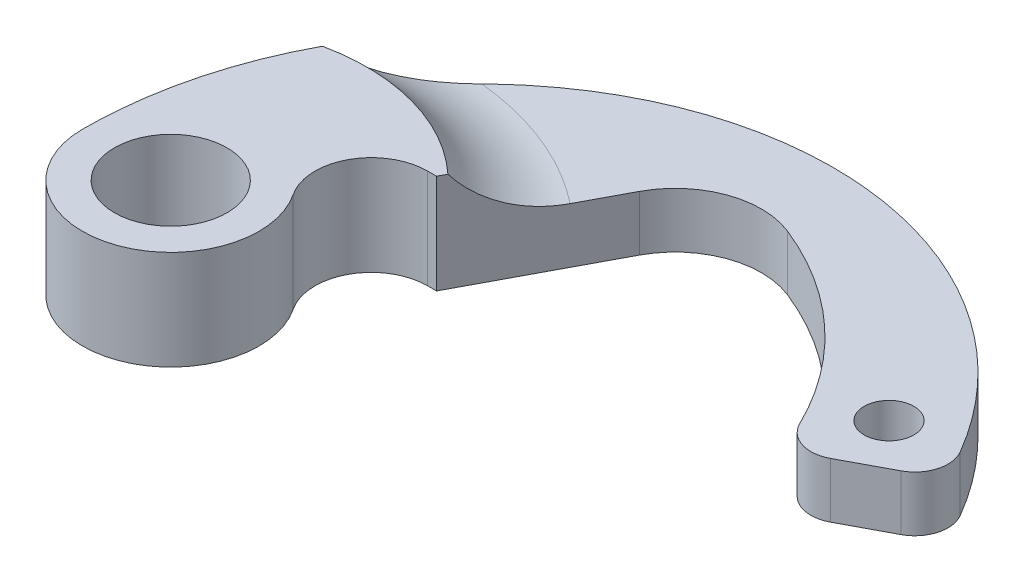
ISO-10303-21;
HEADER;
FILE_DESCRIPTION(('STEP AP214'),'2;1');
FILE_NAME('part.step','',(''),(''),'','','');
FILE_SCHEMA(('AUTOMOTIVE_DESIGN { 1 0 10303 214 1 1 1 1 }'));
ENDSEC;
DATA;
#1=APPLICATION_CONTEXT('core data for automotive mechanical design processes');
#2=APPLICATION_PROTOCOL_DEFINITION('international standard','automotive_design',2000,#1);
#3=PRODUCT_CONTEXT('',#1,'mechanical');
#4=PRODUCT('Part','Part','',(#3));
#5=PRODUCT_RELATED_PRODUCT_CATEGORY('part','',(#4));
#6=PRODUCT_DEFINITION_FORMATION('','',#4);
#7=PRODUCT_DEFINITION_CONTEXT('part definition',#1,'design');
#8=PRODUCT_DEFINITION('design','',#6,#7);
#9=PRODUCT_DEFINITION_SHAPE('','',#8);
#10=(LENGTH_UNIT() NAMED_UNIT(*) SI_UNIT(.MILLI.,.METRE.));
#11=(NAMED_UNIT(*) PLANE_ANGLE_UNIT() SI_UNIT($,.RADIAN.));
#12=(NAMED_UNIT(*) SI_UNIT($,.STERADIAN.) SOLID_ANGLE_UNIT());
#13=UNCERTAINTY_MEASURE_WITH_UNIT(LENGTH_MEASURE(1.E-05),#10,'distance_accuracy_value','');
#14=(GEOMETRIC_REPRESENTATION_CONTEXT(3) GLOBAL_UNCERTAINTY_ASSIGNED_CONTEXT((#13)) GLOBAL_UNIT_ASSIGNED_CONTEXT((#10,
#11,#12)) REPRESENTATION_CONTEXT('',''));
#15=CARTESIAN_POINT('',(0.,0.,0.));
#16=DIRECTION('',(0.,0.,1.));
#17=DIRECTION('',(1.,0.,0.));
#18=AXIS2_PLACEMENT_3D('',#15,#16,#17);
#19=CARTESIAN_POINT('',(10.90971022612,9.,-7.25177376798902));
#20=DIRECTION('',(0.,-1.,0.));
#21=DIRECTION('',(0.,0.,-1.));
#22=AXIS2_PLACEMENT_3D('',#19,#20,#21);
#23=CYLINDRICAL_SURFACE('',#22,5.1);
#24=DIRECTION('',(0.,1.,0.));
#25=VECTOR('',#24,1.);
#26=CARTESIAN_POINT('',(10.90971022612,9.,-12.351773767989));
#27=LINE('',#26,#25);
#28=CARTESIAN_POINT('',(10.90971022612,9.,-12.351773767989));
#29=VERTEX_POINT('',#28);
#30=CARTESIAN_POINT('',(10.90971022612,0.,-12.351773767989));
#31=VERTEX_POINT('',#30);
#32=EDGE_CURVE('E230',#29,#31,#27,.F.);
#33=ORIENTED_EDGE('',*,*,#32,.F.);
#34=CARTESIAN_POINT('',(10.90971022612,9.,-7.25177376798902));
#35=DIRECTION('',(0.,1.,0.));
#36=DIRECTION('',(0.,0.,1.));
#37=AXIS2_PLACEMENT_3D('',#34,#35,#36);
#38=CIRCLE('',#37,5.1);
#39=CARTESIAN_POINT('',(6.66241845869922,9.,-4.42856413312306));
#40=VERTEX_POINT('',#39);
#41=EDGE_CURVE('E232',#29,#40,#38,.T.);
#42=ORIENTED_EDGE('',*,*,#41,.T.);
#43=DIRECTION('',(0.,-1.,0.));
#44=VECTOR('',#43,1.);
#45=CARTESIAN_POINT('',(6.66241845869922,9.,-4.42856413312306));
#46=LINE('',#45,#44);
#47=CARTESIAN_POINT('',(6.66241845869922,0.,-4.42856413312306));
#48=VERTEX_POINT('',#47);
#49=EDGE_CURVE('E237',#48,#40,#46,.F.);
#50=ORIENTED_EDGE('',*,*,#49,.F.);
#51=CARTESIAN_POINT('',(10.90971022612,0.,-7.25177376798902));
#52=DIRECTION('',(0.,1.,0.));
#53=DIRECTION('',(0.,0.,1.));
#54=AXIS2_PLACEMENT_3D('',#51,#52,#53);
#55=CIRCLE('',#54,5.1);
#56=EDGE_CURVE('E234',#48,#31,#55,.F.);
#57=ORIENTED_EDGE('',*,*,#56,.T.);
#58=EDGE_LOOP('',(#33,#42,#50,#57));
#59=FACE_BOUND('',#58,.T.);
#60=ADVANCED_FACE('F35',(#59),#23,.F.);
#61=CARTESIAN_POINT('',(25.,9.,0.));
#62=DIRECTION('',(0.,1.,0.));
#63=DIRECTION('',(0.,0.,1.));
#64=AXIS2_PLACEMENT_3D('',#61,#62,#63);
#65=PLANE('',#64);
#66=ORIENTED_EDGE('',*,*,#41,.F.);
#67=DIRECTION('',(1.,0.,0.));
#68=VECTOR('',#67,1.);
#69=CARTESIAN_POINT('',(11.7166358686802,9.,-12.351773767989));
#70=LINE('',#69,#68);
#71=CARTESIAN_POINT('',(11.7166358686802,9.,-12.351773767989));
#72=VERTEX_POINT('',#71);
#73=EDGE_CURVE('E148',#29,#72,#70,.T.);
#74=ORIENTED_EDGE('',*,*,#73,.T.);
#75=DIRECTION('',(0.469111278589283,0.,-0.883139065096958));
#76=VECTOR('',#75,1.);
#77=CARTESIAN_POINT('',(18.0868775367037,9.,-24.3442572743715));
#78=LINE('',#77,#76);
#79=CARTESIAN_POINT('',(12.0745900467502,9.,-13.0256508044119));
#80=VERTEX_POINT('',#79);
#81=EDGE_CURVE('E132',#72,#80,#78,.T.);
#82=ORIENTED_EDGE('',*,*,#81,.T.);
#83=CARTESIAN_POINT('',(0.,9.,0.));
#84=DIRECTION('',(0.,1.,0.));
#85=DIRECTION('',(0.,0.,1.));
#86=AXIS2_PLACEMENT_3D('',#83,#84,#85);
#87=CIRCLE('',#86,17.7612866559705);
#88=CARTESIAN_POINT('',(-3.64174351131785,9.,-17.3839295866421));
#89=VERTEX_POINT('',#88);
#90=EDGE_CURVE('E145',#80,#89,#87,.T.);
#91=ORIENTED_EDGE('',*,*,#90,.T.);
#92=CARTESIAN_POINT('',(25.,9.,0.));
#93=DIRECTION('',(0.,1.,0.));
#94=DIRECTION('',(0.,0.,-1.));
#95=AXIS2_PLACEMENT_3D('',#92,#93,#94);
#96=ELLIPSE('',#95,35.,33.);
#97=CARTESIAN_POINT('',(-8.,9.,0.));
#98=VERTEX_POINT('',#97);
#99=EDGE_CURVE('E175',#89,#98,#96,.T.);
#100=ORIENTED_EDGE('',*,*,#99,.T.);
#101=CARTESIAN_POINT('',(0.,9.,0.));
#102=DIRECTION('',(0.,1.,0.));
#103=DIRECTION('',(0.,0.,1.));
#104=AXIS2_PLACEMENT_3D('',#101,#102,#103);
#105=CIRCLE('',#104,8.);
#106=EDGE_CURVE('E178',#98,#40,#105,.T.);
#107=ORIENTED_EDGE('',*,*,#106,.T.);
#108=EDGE_LOOP('',(#66,#74,#82,#91,#100,#107));
#109=FACE_BOUND('',#108,.T.);
#110=CARTESIAN_POINT('',(0.,9.,0.));
#111=DIRECTION('',(0.,1.,0.));
#112=DIRECTION('',(0.,0.,1.));
#113=AXIS2_PLACEMENT_3D('',#110,#111,#112);
#114=CIRCLE('',#113,5.1);
#115=CARTESIAN_POINT('',(0.,9.,5.1));
#116=VERTEX_POINT('',#115);
#117=EDGE_CURVE('E169',#116,#116,#114,.T.);
#118=ORIENTED_EDGE('',*,*,#117,.F.);
#119=EDGE_LOOP('',(#118));
#120=FACE_BOUND('',#119,.T.);
#121=ADVANCED_FACE('F143',(#109,#120),#65,.T.);
#122=CARTESIAN_POINT('',(16.9042057444104,9.,-0.39795671402465));
#123=DIRECTION('',(0.,-1.,0.));
#124=DIRECTION('',(0.,0.,-1.));
#125=AXIS2_PLACEMENT_3D('',#122,#123,#124);
#126=CYLINDRICAL_SURFACE('',#125,29.6586756201597);
#127=CARTESIAN_POINT('',(16.9042057444104,0.,-0.39795671402465));
#128=DIRECTION('',(0.,-1.,0.));
#129=DIRECTION('',(0.,0.,1.));
#130=AXIS2_PLACEMENT_3D('',#127,#128,#129);
#131=CIRCLE('',#130,29.6586756201597);
#132=CARTESIAN_POINT('',(27.9029222889275,0.,-27.9418357784415));
#133=VERTEX_POINT('',#132);
#134=CARTESIAN_POINT('',(43.5661640097055,0.,-13.3893777679941));
#135=VERTEX_POINT('',#134);
#136=EDGE_CURVE('E172',#133,#135,#131,.T.);
#137=ORIENTED_EDGE('',*,*,#136,.T.);
#138=DIRECTION('',(0.,-1.,0.));
#139=VECTOR('',#138,1.);
#140=CARTESIAN_POINT('',(43.5661640097055,9.,-13.3893777679941));
#141=LINE('',#140,#139);
#142=CARTESIAN_POINT('',(43.5661640097055,5.,-13.3893777679941));
#143=VERTEX_POINT('',#142);
#144=EDGE_CURVE('E58',#135,#143,#141,.F.);
#145=ORIENTED_EDGE('',*,*,#144,.T.);
#146=CARTESIAN_POINT('',(16.9042057444104,5.,-0.39795671402465));
#147=DIRECTION('',(0.,1.,0.));
#148=DIRECTION('',(0.,0.,1.));
#149=AXIS2_PLACEMENT_3D('',#146,#147,#148);
#150=CIRCLE('',#149,29.6586756201597);
#151=CARTESIAN_POINT('',(27.9029222889275,5.,-27.9418357784415));
#152=VERTEX_POINT('',#151);
#153=EDGE_CURVE('E156',#152,#143,#150,.F.);
#154=ORIENTED_EDGE('',*,*,#153,.F.);
#155=DIRECTION('',(0.,-1.,0.));
#156=VECTOR('',#155,1.);
#157=CARTESIAN_POINT('',(27.9029222889275,9.,-27.9418357784415));
#158=LINE('',#157,#156);
#159=EDGE_CURVE('E150',#152,#133,#158,.T.);
#160=ORIENTED_EDGE('',*,*,#159,.T.);
#161=EDGE_LOOP('',(#137,#145,#154,#160));
#162=FACE_BOUND('',#161,.T.);
#163=ADVANCED_FACE('F226',(#162),#126,.F.);
#164=CARTESIAN_POINT('',(54.500433263048,9.,-15.6856586040627));
#165=DIRECTION('',(-0.469471562785892,0.,-0.882947592858926));
#166=DIRECTION('',(-0.882947592858926,0.,0.469471562785892));
#167=AXIS2_PLACEMENT_3D('',#164,#165,#166);
#168=PLANE('',#167);
#169=DIRECTION('',(0.882947592858926,0.,-0.469471562785892));
#170=VECTOR('',#169,1.);
#171=CARTESIAN_POINT('',(54.500433263048,5.,-15.6856586040627));
#172=LINE('',#171,#170);
#173=CARTESIAN_POINT('',(47.671458215553,5.,-12.0546281627287));
#174=VERTEX_POINT('',#173);
#175=CARTESIAN_POINT('',(51.8632684209968,5.,-14.283453184698));
#176=VERTEX_POINT('',#175);
#177=EDGE_CURVE('E164',#174,#176,#172,.T.);
#178=ORIENTED_EDGE('',*,*,#177,.F.);
#179=DIRECTION('',(0.,-1.,0.));
#180=VECTOR('',#179,1.);
#181=CARTESIAN_POINT('',(47.671458215553,9.,-12.0546281627287));
#182=LINE('',#181,#180);
#183=CARTESIAN_POINT('',(47.671458215553,0.,-12.0546281627287));
#184=VERTEX_POINT('',#183);
#185=EDGE_CURVE('E296',#174,#184,#182,.T.);
#186=ORIENTED_EDGE('',*,*,#185,.T.);
#187=DIRECTION('',(0.882947592858926,0.,-0.469471562785892));
#188=VECTOR('',#187,1.);
#189=CARTESIAN_POINT('',(54.500433263048,0.,-15.6856586040627));
#190=LINE('',#189,#188);
#191=CARTESIAN_POINT('',(51.8632684209968,0.,-14.283453184698));
#192=VERTEX_POINT('',#191);
#193=EDGE_CURVE('E245',#184,#192,#190,.T.);
#194=ORIENTED_EDGE('',*,*,#193,.T.);
#195=DIRECTION('',(0.,-1.,0.));
#196=VECTOR('',#195,1.);
#197=CARTESIAN_POINT('',(51.8632684209968,9.,-14.283453184698));
#198=LINE('',#197,#196);
#199=EDGE_CURVE('E138',#192,#176,#198,.F.);
#200=ORIENTED_EDGE('',*,*,#199,.T.);
#201=EDGE_LOOP('',(#178,#186,#194,#200));
#202=FACE_BOUND('',#201,.T.);
#203=ADVANCED_FACE('F187',(#202),#168,.F.);
#204=DIRECTION('',(0.,-1.,0.));
#205=VECTOR('',#204,1.);
#206=SURFACE_OF_LINEAR_EXTRUSION('',#96,#205);
#207=CARTESIAN_POINT('',(25.,5.,0.));
#208=DIRECTION('',(0.,1.,0.));
#209=DIRECTION('',(0.,0.,-1.));
#210=AXIS2_PLACEMENT_3D('',#207,#208,#209);
#211=ELLIPSE('',#210,35.,33.);
#212=CARTESIAN_POINT('',(53.0446090838756,5.,-18.4466166759187));
#213=VERTEX_POINT('',#212);
#214=CARTESIAN_POINT('',(2.53357024373519,5.,-25.6363981867801));
#215=VERTEX_POINT('',#214);
#216=EDGE_CURVE('E166',#213,#215,#211,.T.);
#217=ORIENTED_EDGE('',*,*,#216,.F.);
#218=DIRECTION('',(0.,-1.,0.));
#219=VECTOR('',#218,1.);
#220=CARTESIAN_POINT('',(53.0446090838756,5.,-18.4466166759187));
#221=LINE('',#220,#219);
#222=CARTESIAN_POINT('',(53.0446090838756,0.,-18.4466166759187));
#223=VERTEX_POINT('',#222);
#224=EDGE_CURVE('E12',#213,#223,#221,.T.);
#225=ORIENTED_EDGE('',*,*,#224,.T.);
#226=CARTESIAN_POINT('',(25.,0.,0.));
#227=DIRECTION('',(0.,1.,0.));
#228=DIRECTION('',(0.,0.,-1.));
#229=AXIS2_PLACEMENT_3D('',#226,#227,#228);
#230=ELLIPSE('',#229,35.,33.);
#231=CARTESIAN_POINT('',(-8.,0.,0.));
#232=VERTEX_POINT('',#231);
#233=EDGE_CURVE('E248',#223,#232,#230,.T.);
#234=ORIENTED_EDGE('',*,*,#233,.T.);
#235=DIRECTION('',(0.,-1.,0.));
#236=VECTOR('',#235,1.);
#237=CARTESIAN_POINT('',(-8.,9.,0.));
#238=LINE('',#237,#236);
#239=EDGE_CURVE('E264',#98,#232,#238,.T.);
#240=ORIENTED_EDGE('',*,*,#239,.F.);
#241=ORIENTED_EDGE('',*,*,#99,.F.);
#242=CARTESIAN_POINT('',(-3.64174351131785,9.,-17.3839295866421));
#243=CARTESIAN_POINT('',(-3.56395732762955,8.83312212612652,-17.5281094257148));
#244=CARTESIAN_POINT('',(-3.4826670326659,8.67146532931295,-17.6763755834181));
#245=CARTESIAN_POINT('',(-3.31333633161754,8.35883321943146,-17.9797742610951));
#246=CARTESIAN_POINT('',(-3.22530317548379,8.207846760408,-18.1348993325071));
#247=CARTESIAN_POINT('',(-3.04260372604045,7.91647958849689,-18.4509777269176));
#248=CARTESIAN_POINT('',(-2.94793922285573,7.77609603447002,-18.6119294713861));
#249=CARTESIAN_POINT('',(-2.75259006990459,7.50656053985838,-18.9378846511956));
#250=CARTESIAN_POINT('',(-2.65193678958115,7.3773575063951,-19.1028646943472));
#251=CARTESIAN_POINT('',(-2.44432922320841,7.129386853794,-19.4367265612221));
#252=CARTESIAN_POINT('',(-2.3373734895944,7.01062164777414,-19.605609275865));
#253=CARTESIAN_POINT('',(-2.11734469740343,6.78352827218744,-19.9463754664236));
#254=CARTESIAN_POINT('',(-2.00427128572978,6.67520070606006,-20.118259115157));
#255=CARTESIAN_POINT('',(-1.71481052954809,6.41796580933637,-20.549725289491));
#256=CARTESIAN_POINT('',(-1.53474246874654,6.27545117292501,-20.8106812183591));
#257=CARTESIAN_POINT('',(-1.16190772867752,6.0134195365567,-21.3350740690085));
#258=CARTESIAN_POINT('',(-0.969138738067562,5.89390673812674,-21.5985114348497));
#259=CARTESIAN_POINT('',(-0.571332227730035,5.67751570579316,-22.1259925568813));
#260=CARTESIAN_POINT('',(-0.366279818573743,5.58066566971994,-22.3900366600411));
#261=CARTESIAN_POINT('',(0.0550514704378763,5.40954020747101,-22.9163468181948));
#262=CARTESIAN_POINT('',(0.271329005753551,5.33526208491604,-23.1786130819022));
#263=CARTESIAN_POINT('',(0.813564870319333,5.18069866929601,-23.8163377467831));
#264=CARTESIAN_POINT('',(1.14530539823243,5.11259191528258,-24.1899450674455));
#265=CARTESIAN_POINT('',(1.65649156405961,5.0448519055715,-24.7405452773684));
#266=CARTESIAN_POINT('',(1.82889969749067,5.02800821128267,-24.9221970598141));
#267=CARTESIAN_POINT('',(2.17806112901645,5.00558510340013,-25.2820179117441));
#268=CARTESIAN_POINT('',(2.35481480457293,5.00000667185175,-25.4601866762571));
#269=CARTESIAN_POINT('',(2.53357024373519,5.,-25.6363981867801));
#270=B_SPLINE_CURVE_WITH_KNOTS('',3,(#242,#243,#244,#245,#246,#247,#248,#249,#250,#251,#252,
#253,#254,#255,#256,#257,#258,#259,#260,#261,#262,#263,#264,#265,#266,#267,#268,#269),
.UNSPECIFIED.,.F.,.F.,(4,2,2,2,2,2,2,2,2,2,2,2,2,4),(0.,0.701376650592679,1.40200948778742,
2.10245391339597,2.79950673788444,3.49672029218557,4.19397413088532,5.23570569605183,
6.27762736419985,7.32083861643691,8.36392520046946,9.87365656077698,10.6264258310938,
11.3792607209751),.UNSPECIFIED.);
#271=EDGE_CURVE('E139',#89,#215,#270,.T.);
#272=ORIENTED_EDGE('',*,*,#271,.T.);
#273=EDGE_LOOP('',(#217,#225,#234,#240,#241,#272));
#274=FACE_BOUND('',#273,.T.);
#275=ADVANCED_FACE('F182',(#274),#206,.F.);
#276=CARTESIAN_POINT('',(18.0868775367037,9.,-24.3442572743715));
#277=DIRECTION('',(-0.883139065096957,0.,-0.469111278589283));
#278=DIRECTION('',(-0.469111278589283,0.,0.883139065096958));
#279=AXIS2_PLACEMENT_3D('',#276,#277,#278);
#280=PLANE('',#279);
#281=DIRECTION('',(0.469111278589283,0.,-0.883139065096958));
#282=VECTOR('',#281,1.);
#283=CARTESIAN_POINT('',(18.0868775367037,5.,-24.3442572743715));
#284=LINE('',#283,#282);
#285=CARTESIAN_POINT('',(15.9156505802996,5.,-20.2567508938845));
#286=VERTEX_POINT('',#285);
#287=CARTESIAN_POINT('',(18.0868775367037,5.,-24.3442572743715));
#288=VERTEX_POINT('',#287);
#289=EDGE_CURVE('E134',#286,#288,#284,.T.);
#290=ORIENTED_EDGE('',*,*,#289,.F.);
#291=CARTESIAN_POINT('',(15.9156505802996,5.,-20.2567508938845));
#292=CARTESIAN_POINT('',(15.778561621567,4.99997034851263,-19.9986700922157));
#293=CARTESIAN_POINT('',(15.6414779280634,5.01240840634832,-19.7405992027567));
#294=CARTESIAN_POINT('',(15.3683027839555,5.06192181367968,-19.2263253995332));
#295=CARTESIAN_POINT('',(15.2322112596888,5.09899531492112,-18.9701223470934));
#296=CARTESIAN_POINT('',(14.9620303361065,5.19746369796504,-18.4614854007017));
#297=CARTESIAN_POINT('',(14.8279402282056,5.25884974946351,-18.2090501727821));
#298=CARTESIAN_POINT('',(14.5626600794596,5.40544559423234,-17.7096393224252));
#299=CARTESIAN_POINT('',(14.4314699951027,5.49065502979549,-17.4626636180734));
#300=CARTESIAN_POINT('',(14.1728465712417,5.68431517875692,-16.9757845785252));
#301=CARTESIAN_POINT('',(14.0454151508379,5.79277753872048,-16.7358848561868));
#302=CARTESIAN_POINT('',(13.7952781395473,6.03213948565181,-16.2649821591516));
#303=CARTESIAN_POINT('',(13.6725725729358,6.16303918785449,-16.0339792301549));
#304=CARTESIAN_POINT('',(13.4328541209312,6.44626291165231,-15.5826902945607));
#305=CARTESIAN_POINT('',(13.3158366138243,6.59856913452728,-15.3623955872214));
#306=CARTESIAN_POINT('',(13.0882738076911,6.92357440045645,-14.9339906158814));
#307=CARTESIAN_POINT('',(12.9777270788616,7.09626891281378,-14.7258776601632));
#308=CARTESIAN_POINT('',(12.7228262681551,7.53100074026317,-14.2460067341501));
#309=CARTESIAN_POINT('',(12.5817521583594,7.80191366143389,-13.9804235705795));
#310=CARTESIAN_POINT('',(12.3822080656642,8.23316377267619,-13.6047660421602));
#311=CARTESIAN_POINT('',(12.3177061351486,8.38105624240429,-13.4833360590999));
#312=CARTESIAN_POINT('',(12.1929285926872,8.68472015885605,-13.2484324717766));
#313=CARTESIAN_POINT('',(12.1326527967774,8.84049126211331,-13.1349585211868));
#314=CARTESIAN_POINT('',(12.0745900467502,9.,-13.0256508044119));
#315=B_SPLINE_CURVE_WITH_KNOTS('',3,(#291,#292,#293,#294,#295,#296,#297,#298,#299,#300,#301,
#302,#303,#304,#305,#306,#307,#308,#309,#310,#311,#312,#313,#314),.UNSPECIFIED.,.F.,.F.,(4,2,2,
2,2,2,2,2,2,2,2,4),(0.,0.876412944749713,1.75276014474895,2.62878934741122,3.50480539723507,
4.38126124180473,5.25772158785892,6.13345745429279,7.00899907923236,8.22008299592423,
8.82559205637892,9.4310747425835),.UNSPECIFIED.);
#316=EDGE_CURVE('E128',#286,#80,#315,.T.);
#317=ORIENTED_EDGE('',*,*,#316,.T.);
#318=ORIENTED_EDGE('',*,*,#81,.F.);
#319=DIRECTION('',(0.,-1.,0.));
#320=VECTOR('',#319,1.);
#321=CARTESIAN_POINT('',(11.7166358686802,9.,-12.351773767989));
#322=LINE('',#321,#320);
#323=CARTESIAN_POINT('',(11.7166358686802,0.,-12.351773767989));
#324=VERTEX_POINT('',#323);
#325=EDGE_CURVE('E241',#72,#324,#322,.T.);
#326=ORIENTED_EDGE('',*,*,#325,.T.);
#327=DIRECTION('',(0.469111278589283,0.,-0.883139065096958));
#328=VECTOR('',#327,1.);
#329=CARTESIAN_POINT('',(18.0868775367037,0.,-24.3442572743715));
#330=LINE('',#329,#328);
#331=CARTESIAN_POINT('',(18.0868775367037,0.,-24.3442572743715));
#332=VERTEX_POINT('',#331);
#333=EDGE_CURVE('E255',#324,#332,#330,.T.);
#334=ORIENTED_EDGE('',*,*,#333,.T.);
#335=DIRECTION('',(0.,-1.,0.));
#336=VECTOR('',#335,1.);
#337=CARTESIAN_POINT('',(18.0868775367037,9.,-24.3442572743715));
#338=LINE('',#337,#336);
#339=EDGE_CURVE('E261',#288,#332,#338,.T.);
#340=ORIENTED_EDGE('',*,*,#339,.F.);
#341=EDGE_LOOP('',(#290,#317,#318,#326,#334,#340));
#342=FACE_BOUND('',#341,.T.);
#343=ADVANCED_FACE('F130',(#342),#280,.F.);
#344=CARTESIAN_POINT('',(25.,9.,-20.6721020657859));
#345=DIRECTION('',(0.,-1.,0.));
#346=DIRECTION('',(0.,0.,-1.));
#347=AXIS2_PLACEMENT_3D('',#344,#345,#346);
#348=CYLINDRICAL_SURFACE('',#347,7.82789793421415);
#349=CARTESIAN_POINT('',(25.,5.,-20.6721020657859));
#350=DIRECTION('',(0.,1.,0.));
#351=DIRECTION('',(0.,0.,1.));
#352=AXIS2_PLACEMENT_3D('',#349,#350,#351);
#353=CIRCLE('',#352,7.82789793421415);
#354=EDGE_CURVE('E238',#288,#152,#353,.F.);
#355=ORIENTED_EDGE('',*,*,#354,.F.);
#356=ORIENTED_EDGE('',*,*,#339,.T.);
#357=CARTESIAN_POINT('',(25.,0.,-20.6721020657859));
#358=DIRECTION('',(0.,-1.,0.));
#359=DIRECTION('',(0.,0.,1.));
#360=AXIS2_PLACEMENT_3D('',#357,#358,#359);
#361=CIRCLE('',#360,7.82789793421415);
#362=EDGE_CURVE('E179',#332,#133,#361,.T.);
#363=ORIENTED_EDGE('',*,*,#362,.T.);
#364=ORIENTED_EDGE('',*,*,#159,.F.);
#365=EDGE_LOOP('',(#355,#356,#363,#364));
#366=FACE_BOUND('',#365,.T.);
#367=ADVANCED_FACE('F285',(#366),#348,.F.);
#368=CARTESIAN_POINT('',(25.,0.,0.));
#369=DIRECTION('',(0.,1.,0.));
#370=DIRECTION('',(0.,0.,1.));
#371=AXIS2_PLACEMENT_3D('',#368,#369,#370);
#372=PLANE('',#371);
#373=CARTESIAN_POINT('',(47.3697619415179,0.,-17.6715759222276));
#374=DIRECTION('',(0.,1.,0.));
#375=DIRECTION('',(0.,0.,1.));
#376=AXIS2_PLACEMENT_3D('',#373,#374,#375);
#377=CIRCLE('',#376,2.25);
#378=CARTESIAN_POINT('',(47.3697619415179,0.,-15.4215759222276));
#379=VERTEX_POINT('',#378);
#380=EDGE_CURVE('E154',#379,#379,#377,.T.);
#381=ORIENTED_EDGE('',*,*,#380,.T.);
#382=EDGE_LOOP('',(#381));
#383=FACE_BOUND('',#382,.T.);
#384=ORIENTED_EDGE('',*,*,#193,.F.);
#385=CARTESIAN_POINT('',(46.2630435271953,0.,-14.7034709413055));
#386=DIRECTION('',(0.,1.,0.));
#387=DIRECTION('',(0.,0.,1.));
#388=AXIS2_PLACEMENT_3D('',#385,#386,#387);
#389=CIRCLE('',#388,3.);
#390=EDGE_CURVE('E287',#184,#135,#389,.F.);
#391=ORIENTED_EDGE('',*,*,#390,.T.);
#392=ORIENTED_EDGE('',*,*,#136,.F.);
#393=ORIENTED_EDGE('',*,*,#362,.F.);
#394=ORIENTED_EDGE('',*,*,#333,.F.);
#395=DIRECTION('',(1.,0.,0.));
#396=VECTOR('',#395,1.);
#397=CARTESIAN_POINT('',(11.7166358686802,0.,-12.351773767989));
#398=LINE('',#397,#396);
#399=EDGE_CURVE('E253',#31,#324,#398,.T.);
#400=ORIENTED_EDGE('',*,*,#399,.F.);
#401=ORIENTED_EDGE('',*,*,#56,.F.);
#402=CARTESIAN_POINT('',(0.,0.,0.));
#403=DIRECTION('',(0.,1.,0.));
#404=DIRECTION('',(0.,0.,1.));
#405=AXIS2_PLACEMENT_3D('',#402,#403,#404);
#406=CIRCLE('',#405,8.);
#407=EDGE_CURVE('E250',#232,#48,#406,.T.);
#408=ORIENTED_EDGE('',*,*,#407,.F.);
#409=ORIENTED_EDGE('',*,*,#233,.F.);
#410=CARTESIAN_POINT('',(50.4548537326392,0.,-16.9322959632748));
#411=DIRECTION('',(0.,1.,0.));
#412=DIRECTION('',(0.,0.,1.));
#413=AXIS2_PLACEMENT_3D('',#410,#411,#412);
#414=CIRCLE('',#413,3.);
#415=EDGE_CURVE('E291',#223,#192,#414,.F.);
#416=ORIENTED_EDGE('',*,*,#415,.T.);
#417=EDGE_LOOP('',(#384,#391,#392,#393,#394,#400,#401,#408,#409,#416));
#418=FACE_BOUND('',#417,.T.);
#419=CARTESIAN_POINT('',(0.,0.,0.));
#420=DIRECTION('',(0.,1.,0.));
#421=DIRECTION('',(0.,0.,1.));
#422=AXIS2_PLACEMENT_3D('',#419,#420,#421);
#423=CIRCLE('',#422,5.1);
#424=CARTESIAN_POINT('',(0.,0.,5.1));
#425=VERTEX_POINT('',#424);
#426=EDGE_CURVE('E168',#425,#425,#423,.T.);
#427=ORIENTED_EDGE('',*,*,#426,.T.);
#428=EDGE_LOOP('',(#427));
#429=FACE_BOUND('',#428,.T.);
#430=ADVANCED_FACE('F278',(#383,#418,#429),#372,.F.);
#431=CARTESIAN_POINT('',(0.,9.,0.));
#432=DIRECTION('',(0.,-1.,0.));
#433=DIRECTION('',(0.,0.,-1.));
#434=AXIS2_PLACEMENT_3D('',#431,#432,#433);
#435=CYLINDRICAL_SURFACE('',#434,8.);
#436=ORIENTED_EDGE('',*,*,#407,.T.);
#437=ORIENTED_EDGE('',*,*,#49,.T.);
#438=ORIENTED_EDGE('',*,*,#106,.F.);
#439=ORIENTED_EDGE('',*,*,#239,.T.);
#440=EDGE_LOOP('',(#436,#437,#438,#439));
#441=FACE_BOUND('',#440,.T.);
#442=ADVANCED_FACE('F189',(#441),#435,.T.);
#443=CARTESIAN_POINT('',(11.7166358686802,9.,-12.351773767989));
#444=DIRECTION('',(0.,0.,-1.));
#445=DIRECTION('',(-1.,0.,0.));
#446=AXIS2_PLACEMENT_3D('',#443,#444,#445);
#447=PLANE('',#446);
#448=ORIENTED_EDGE('',*,*,#73,.F.);
#449=ORIENTED_EDGE('',*,*,#32,.T.);
#450=ORIENTED_EDGE('',*,*,#399,.T.);
#451=ORIENTED_EDGE('',*,*,#325,.F.);
#452=EDGE_LOOP('',(#448,#449,#450,#451));
#453=FACE_BOUND('',#452,.T.);
#454=ADVANCED_FACE('F240',(#453),#447,.F.);
#455=CARTESIAN_POINT('',(0.,9.,0.));
#456=DIRECTION('',(0.,-1.,0.));
#457=DIRECTION('',(0.,0.,-1.));
#458=AXIS2_PLACEMENT_3D('',#455,#456,#457);
#459=CYLINDRICAL_SURFACE('',#458,5.1);
#460=ORIENTED_EDGE('',*,*,#117,.T.);
#461=EDGE_LOOP('',(#460));
#462=FACE_BOUND('',#461,.T.);
#463=ORIENTED_EDGE('',*,*,#426,.F.);
#464=EDGE_LOOP('',(#463));
#465=FACE_BOUND('',#464,.T.);
#466=ADVANCED_FACE('F341',(#462,#465),#459,.F.);
#467=CARTESIAN_POINT('',(18.3695733035388,5.,-8.61935667201476));
#468=DIRECTION('',(0.,1.,0.));
#469=DIRECTION('',(0.,0.,1.));
#470=AXIS2_PLACEMENT_3D('',#467,#468,#469);
#471=PLANE('',#470);
#472=CARTESIAN_POINT('',(47.3697619415179,5.,-17.6715759222276));
#473=DIRECTION('',(0.,1.,0.));
#474=DIRECTION('',(0.,0.,1.));
#475=AXIS2_PLACEMENT_3D('',#472,#473,#474);
#476=CIRCLE('',#475,2.25);
#477=CARTESIAN_POINT('',(47.3697619415179,5.,-15.4215759222276));
#478=VERTEX_POINT('',#477);
#479=EDGE_CURVE('E159',#478,#478,#476,.T.);
#480=ORIENTED_EDGE('',*,*,#479,.F.);
#481=EDGE_LOOP('',(#480));
#482=FACE_BOUND('',#481,.T.);
#483=ORIENTED_EDGE('',*,*,#153,.T.);
#484=CARTESIAN_POINT('',(46.2630435271953,5.,-14.7034709413055));
#485=DIRECTION('',(0.,1.,0.));
#486=DIRECTION('',(0.,0.,1.));
#487=AXIS2_PLACEMENT_3D('',#484,#485,#486);
#488=CIRCLE('',#487,3.);
#489=EDGE_CURVE('E43',#143,#174,#488,.T.);
#490=ORIENTED_EDGE('',*,*,#489,.T.);
#491=ORIENTED_EDGE('',*,*,#177,.T.);
#492=CARTESIAN_POINT('',(50.4548537326392,5.,-16.9322959632748));
#493=DIRECTION('',(0.,1.,0.));
#494=DIRECTION('',(0.,0.,1.));
#495=AXIS2_PLACEMENT_3D('',#492,#493,#494);
#496=CIRCLE('',#495,3.);
#497=EDGE_CURVE('E50',#176,#213,#496,.T.);
#498=ORIENTED_EDGE('',*,*,#497,.T.);
#499=ORIENTED_EDGE('',*,*,#216,.T.);
#500=CARTESIAN_POINT('',(0.,5.,0.));
#501=DIRECTION('',(0.,1.,0.));
#502=DIRECTION('',(0.,0.,1.));
#503=AXIS2_PLACEMENT_3D('',#500,#501,#502);
#504=CIRCLE('',#503,25.7612866559705);
#505=EDGE_CURVE('E199',#215,#286,#504,.F.);
#506=ORIENTED_EDGE('',*,*,#505,.T.);
#507=ORIENTED_EDGE('',*,*,#289,.T.);
#508=ORIENTED_EDGE('',*,*,#354,.T.);
#509=EDGE_LOOP('',(#483,#490,#491,#498,#499,#506,#507,#508));
#510=FACE_BOUND('',#509,.T.);
#511=ADVANCED_FACE('F211',(#482,#510),#471,.T.);
#512=CARTESIAN_POINT('',(0.,15.,0.));
#513=DIRECTION('',(0.,1.,0.));
#514=DIRECTION('',(0.,0.,1.));
#515=AXIS2_PLACEMENT_3D('',#512,#513,#514);
#516=TOROIDAL_SURFACE('',#515,25.7612866559705,10.);
#517=ORIENTED_EDGE('',*,*,#316,.F.);
#518=ORIENTED_EDGE('',*,*,#505,.F.);
#519=ORIENTED_EDGE('',*,*,#271,.F.);
#520=ORIENTED_EDGE('',*,*,#90,.F.);
#521=EDGE_LOOP('',(#517,#518,#519,#520));
#522=FACE_BOUND('',#521,.T.);
#523=ADVANCED_FACE('F152',(#522),#516,.F.);
#524=CARTESIAN_POINT('',(46.2630435271953,9.,-14.7034709413055));
#525=DIRECTION('',(0.,-1.,0.));
#526=DIRECTION('',(0.,0.,-1.));
#527=AXIS2_PLACEMENT_3D('',#524,#525,#526);
#528=CYLINDRICAL_SURFACE('',#527,3.);
#529=ORIENTED_EDGE('',*,*,#489,.F.);
#530=ORIENTED_EDGE('',*,*,#144,.F.);
#531=ORIENTED_EDGE('',*,*,#390,.F.);
#532=ORIENTED_EDGE('',*,*,#185,.F.);
#533=EDGE_LOOP('',(#529,#530,#531,#532));
#534=FACE_BOUND('',#533,.T.);
#535=ADVANCED_FACE('F210',(#534),#528,.T.);
#536=CARTESIAN_POINT('',(50.4548537326392,2.5,-16.9322959632748));
#537=DIRECTION('',(0.,-1.,0.));
#538=DIRECTION('',(0.,0.,-1.));
#539=AXIS2_PLACEMENT_3D('',#536,#537,#538);
#540=CYLINDRICAL_SURFACE('',#539,3.);
#541=ORIENTED_EDGE('',*,*,#497,.F.);
#542=ORIENTED_EDGE('',*,*,#199,.F.);
#543=ORIENTED_EDGE('',*,*,#415,.F.);
#544=ORIENTED_EDGE('',*,*,#224,.F.);
#545=EDGE_LOOP('',(#541,#542,#543,#544));
#546=FACE_BOUND('',#545,.T.);
#547=ADVANCED_FACE('F37',(#546),#540,.T.);
#548=CARTESIAN_POINT('',(47.3697619415179,0.,-17.6715759222276));
#549=DIRECTION('',(0.,1.,0.));
#550=DIRECTION('',(0.,0.,1.));
#551=AXIS2_PLACEMENT_3D('',#548,#549,#550);
#552=CYLINDRICAL_SURFACE('',#551,2.25);
#553=ORIENTED_EDGE('',*,*,#380,.F.);
#554=EDGE_LOOP('',(#553));
#555=FACE_BOUND('',#554,.T.);
#556=ORIENTED_EDGE('',*,*,#479,.T.);
#557=EDGE_LOOP('',(#556));
#558=FACE_BOUND('',#557,.T.);
#559=ADVANCED_FACE('F218',(#555,#558),#552,.F.);
#560=CLOSED_SHELL('',(#60,#121,#163,#203,#275,#343,#367,#430,#442,#454,#466,#511,#523,#535,#547,#559));
#561=MANIFOLD_SOLID_BREP('B2',#560);
#562=ADVANCED_BREP_SHAPE_REPRESENTATION('',(#18,#561),#14);
#563=SHAPE_DEFINITION_REPRESENTATION(#9,#562);
ENDSEC;
END-ISO-10303-21;
